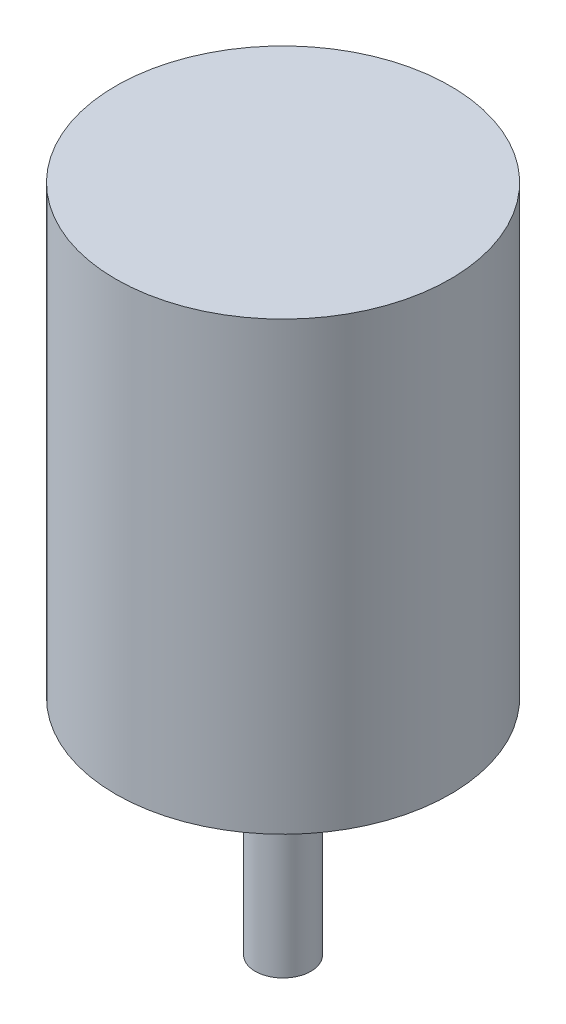
ISO-10303-21;
HEADER;
FILE_DESCRIPTION(('STEP AP214'),'2;1');
FILE_NAME('part.step','',(''),(''),'','','');
FILE_SCHEMA(('AUTOMOTIVE_DESIGN { 1 0 10303 214 1 1 1 1 }'));
ENDSEC;
DATA;
#1=APPLICATION_CONTEXT('core data for automotive mechanical design processes');
#2=APPLICATION_PROTOCOL_DEFINITION('international standard','automotive_design',2000,#1);
#3=PRODUCT_CONTEXT('',#1,'mechanical');
#4=PRODUCT('Part','Part','',(#3));
#5=PRODUCT_RELATED_PRODUCT_CATEGORY('part','',(#4));
#6=PRODUCT_DEFINITION_FORMATION('','',#4);
#7=PRODUCT_DEFINITION_CONTEXT('part definition',#1,'design');
#8=PRODUCT_DEFINITION('design','',#6,#7);
#9=PRODUCT_DEFINITION_SHAPE('','',#8);
#10=(LENGTH_UNIT() NAMED_UNIT(*) SI_UNIT(.MILLI.,.METRE.));
#11=(NAMED_UNIT(*) PLANE_ANGLE_UNIT() SI_UNIT($,.RADIAN.));
#12=(NAMED_UNIT(*) SI_UNIT($,.STERADIAN.) SOLID_ANGLE_UNIT());
#13=UNCERTAINTY_MEASURE_WITH_UNIT(LENGTH_MEASURE(1.E-05),#10,'distance_accuracy_value','');
#14=(GEOMETRIC_REPRESENTATION_CONTEXT(3) GLOBAL_UNCERTAINTY_ASSIGNED_CONTEXT((#13)) GLOBAL_UNIT_ASSIGNED_CONTEXT((#10,
#11,#12)) REPRESENTATION_CONTEXT('',''));
#15=CARTESIAN_POINT('',(0.,0.,0.));
#16=DIRECTION('',(0.,0.,1.));
#17=DIRECTION('',(1.,0.,0.));
#18=AXIS2_PLACEMENT_3D('',#15,#16,#17);
#19=CARTESIAN_POINT('',(0.,20.,0.));
#20=DIRECTION('',(0.,-1.,0.));
#21=DIRECTION('',(0.,0.,-1.));
#22=AXIS2_PLACEMENT_3D('',#19,#20,#21);
#23=CYLINDRICAL_SURFACE('',#22,2.5);
#24=CARTESIAN_POINT('',(0.,20.,0.));
#25=DIRECTION('',(0.,1.,0.));
#26=DIRECTION('',(0.,0.,1.));
#27=AXIS2_PLACEMENT_3D('',#24,#25,#26);
#28=CIRCLE('',#27,2.5);
#29=CARTESIAN_POINT('',(0.,20.,2.5));
#30=VERTEX_POINT('',#29);
#31=EDGE_CURVE('E10',#30,#30,#28,.T.);
#32=ORIENTED_EDGE('',*,*,#31,.F.);
#33=EDGE_LOOP('',(#32));
#34=FACE_BOUND('',#33,.T.);
#35=CARTESIAN_POINT('',(0.,0.,0.));
#36=DIRECTION('',(0.,1.,0.));
#37=DIRECTION('',(0.,0.,1.));
#38=AXIS2_PLACEMENT_3D('',#35,#36,#37);
#39=CIRCLE('',#38,2.5);
#40=CARTESIAN_POINT('',(0.,0.,2.5));
#41=VERTEX_POINT('',#40);
#42=EDGE_CURVE('E38',#41,#41,#39,.T.);
#43=ORIENTED_EDGE('',*,*,#42,.T.);
#44=EDGE_LOOP('',(#43));
#45=FACE_BOUND('',#44,.T.);
#46=ADVANCED_FACE('F35',(#34,#45),#23,.T.);
#47=CARTESIAN_POINT('',(0.,0.,0.));
#48=DIRECTION('',(0.,1.,0.));
#49=DIRECTION('',(0.,0.,1.));
#50=AXIS2_PLACEMENT_3D('',#47,#48,#49);
#51=PLANE('',#50);
#52=ORIENTED_EDGE('',*,*,#42,.F.);
#53=EDGE_LOOP('',(#52));
#54=FACE_BOUND('',#53,.T.);
#55=ADVANCED_FACE('F58',(#54),#51,.F.);
#56=CARTESIAN_POINT('',(0.,60.,0.));
#57=DIRECTION('',(0.,-1.,0.));
#58=DIRECTION('',(0.,0.,-1.));
#59=AXIS2_PLACEMENT_3D('',#56,#57,#58);
#60=CYLINDRICAL_SURFACE('',#59,15.);
#61=CARTESIAN_POINT('',(0.,60.,0.));
#62=DIRECTION('',(0.,1.,0.));
#63=DIRECTION('',(0.,0.,1.));
#64=AXIS2_PLACEMENT_3D('',#61,#62,#63);
#65=CIRCLE('',#64,15.);
#66=CARTESIAN_POINT('',(0.,60.,15.));
#67=VERTEX_POINT('',#66);
#68=EDGE_CURVE('E45',#67,#67,#65,.T.);
#69=ORIENTED_EDGE('',*,*,#68,.F.);
#70=EDGE_LOOP('',(#69));
#71=FACE_BOUND('',#70,.T.);
#72=CARTESIAN_POINT('',(0.,20.,0.));
#73=DIRECTION('',(0.,1.,0.));
#74=DIRECTION('',(0.,0.,1.));
#75=AXIS2_PLACEMENT_3D('',#72,#73,#74);
#76=CIRCLE('',#75,15.);
#77=CARTESIAN_POINT('',(0.,20.,15.));
#78=VERTEX_POINT('',#77);
#79=EDGE_CURVE('E47',#78,#78,#76,.T.);
#80=ORIENTED_EDGE('',*,*,#79,.T.);
#81=EDGE_LOOP('',(#80));
#82=FACE_BOUND('',#81,.T.);
#83=ADVANCED_FACE('F55',(#71,#82),#60,.T.);
#84=CARTESIAN_POINT('',(0.,60.,0.));
#85=DIRECTION('',(0.,1.,0.));
#86=DIRECTION('',(0.,0.,1.));
#87=AXIS2_PLACEMENT_3D('',#84,#85,#86);
#88=PLANE('',#87);
#89=ORIENTED_EDGE('',*,*,#68,.T.);
#90=EDGE_LOOP('',(#89));
#91=FACE_BOUND('',#90,.T.);
#92=ADVANCED_FACE('F53',(#91),#88,.T.);
#93=CARTESIAN_POINT('',(0.,20.,0.));
#94=DIRECTION('',(0.,1.,0.));
#95=DIRECTION('',(0.,0.,1.));
#96=AXIS2_PLACEMENT_3D('',#93,#94,#95);
#97=PLANE('',#96);
#98=ORIENTED_EDGE('',*,*,#31,.T.);
#99=EDGE_LOOP('',(#98));
#100=FACE_BOUND('',#99,.T.);
#101=ORIENTED_EDGE('',*,*,#79,.F.);
#102=EDGE_LOOP('',(#101));
#103=FACE_BOUND('',#102,.T.);
#104=ADVANCED_FACE('F62',(#100,#103),#97,.F.);
#105=CLOSED_SHELL('',(#46,#55,#83,#92,#104));
#106=MANIFOLD_SOLID_BREP('B2',#105);
#107=ADVANCED_BREP_SHAPE_REPRESENTATION('',(#18,#106),#14);
#108=SHAPE_DEFINITION_REPRESENTATION(#9,#107);
ENDSEC;
END-ISO-10303-21;
